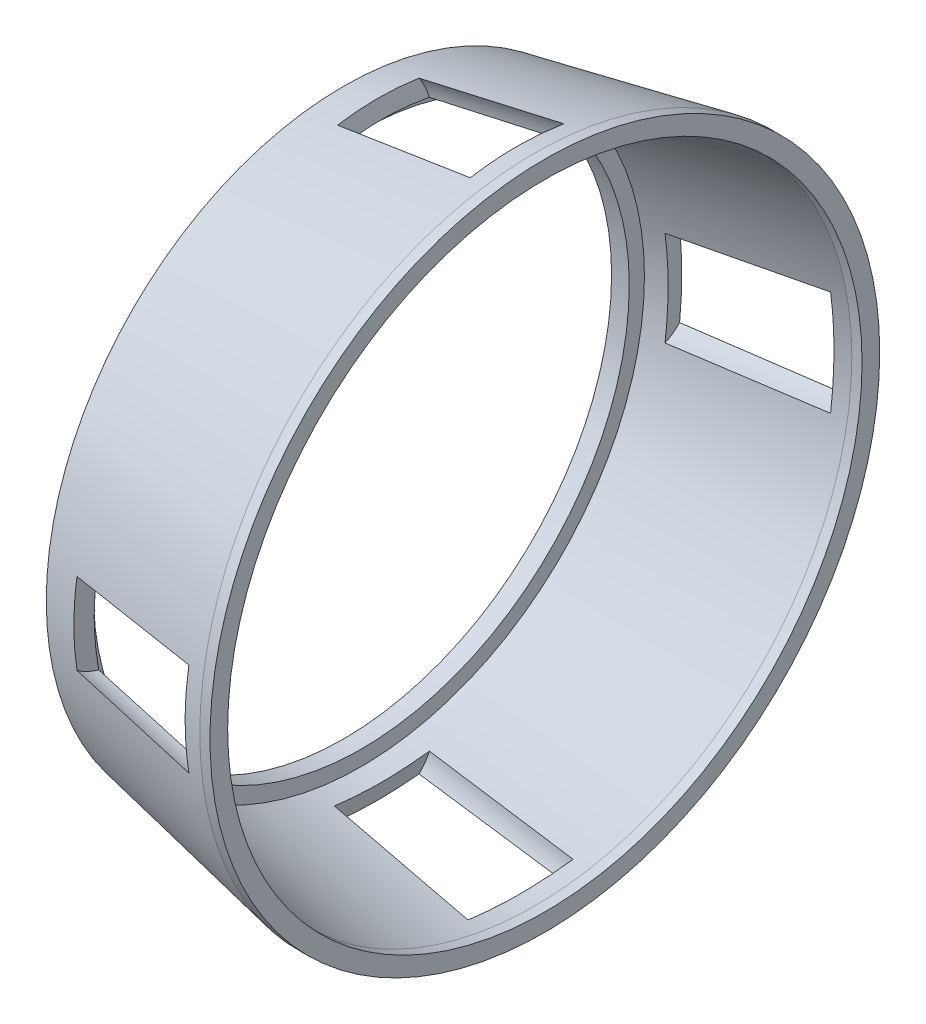
ISO-10303-21;
HEADER;
FILE_DESCRIPTION(('STEP AP214'),'2;1');
FILE_NAME('part.step','',(''),(''),'','','');
FILE_SCHEMA(('AUTOMOTIVE_DESIGN { 1 0 10303 214 1 1 1 1 }'));
ENDSEC;
DATA;
#1=APPLICATION_CONTEXT('core data for automotive mechanical design processes');
#2=APPLICATION_PROTOCOL_DEFINITION('international standard','automotive_design',2000,#1);
#3=PRODUCT_CONTEXT('',#1,'mechanical');
#4=PRODUCT('Part','Part','',(#3));
#5=PRODUCT_RELATED_PRODUCT_CATEGORY('part','',(#4));
#6=PRODUCT_DEFINITION_FORMATION('','',#4);
#7=PRODUCT_DEFINITION_CONTEXT('part definition',#1,'design');
#8=PRODUCT_DEFINITION('design','',#6,#7);
#9=PRODUCT_DEFINITION_SHAPE('','',#8);
#10=(LENGTH_UNIT() NAMED_UNIT(*) SI_UNIT(.MILLI.,.METRE.));
#11=(NAMED_UNIT(*) PLANE_ANGLE_UNIT() SI_UNIT($,.RADIAN.));
#12=(NAMED_UNIT(*) SI_UNIT($,.STERADIAN.) SOLID_ANGLE_UNIT());
#13=UNCERTAINTY_MEASURE_WITH_UNIT(LENGTH_MEASURE(1.E-05),#10,'distance_accuracy_value','');
#14=(GEOMETRIC_REPRESENTATION_CONTEXT(3) GLOBAL_UNCERTAINTY_ASSIGNED_CONTEXT((#13)) GLOBAL_UNIT_ASSIGNED_CONTEXT((#10,
#11,#12)) REPRESENTATION_CONTEXT('',''));
#15=CARTESIAN_POINT('',(0.,0.,0.));
#16=DIRECTION('',(0.,0.,1.));
#17=DIRECTION('',(1.,0.,0.));
#18=AXIS2_PLACEMENT_3D('',#15,#16,#17);
#19=CARTESIAN_POINT('',(15.1355647201062,0.,0.));
#20=DIRECTION('',(1.,0.,0.));
#21=DIRECTION('',(0.,0.,-1.));
#22=AXIS2_PLACEMENT_3D('',#19,#20,#21);
#23=CYLINDRICAL_SURFACE('',#22,25.1514621022042);
#24=CARTESIAN_POINT('',(15.9480647201062,0.,0.));
#25=DIRECTION('',(1.,0.,0.));
#26=DIRECTION('',(0.,0.,-1.));
#27=AXIS2_PLACEMENT_3D('',#24,#25,#26);
#28=CIRCLE('',#27,25.1514621022042);
#29=CARTESIAN_POINT('',(15.9480647201062,0.,-25.1514621022042));
#30=VERTEX_POINT('',#29);
#31=EDGE_CURVE('E367',#30,#30,#28,.F.);
#32=ORIENTED_EDGE('',*,*,#31,.F.);
#33=EDGE_LOOP('',(#32));
#34=FACE_BOUND('',#33,.T.);
#35=CARTESIAN_POINT('',(15.1355647201061,0.,0.));
#36=DIRECTION('',(1.,0.,0.));
#37=DIRECTION('',(0.,0.,1.));
#38=AXIS2_PLACEMENT_3D('',#35,#36,#37);
#39=CIRCLE('',#38,25.1514621022042);
#40=CARTESIAN_POINT('',(15.1355647201062,0.,25.1514621022042));
#41=VERTEX_POINT('',#40);
#42=EDGE_CURVE('E312',#41,#41,#39,.T.);
#43=ORIENTED_EDGE('',*,*,#42,.F.);
#44=EDGE_LOOP('',(#43));
#45=FACE_BOUND('',#44,.T.);
#46=ADVANCED_FACE('F16',(#34,#45),#23,.F.);
#47=CARTESIAN_POINT('',(1.4,0.,21.8409584046857));
#48=DIRECTION('',(1.,0.,0.));
#49=DIRECTION('',(0.,0.,-1.));
#50=AXIS2_PLACEMENT_3D('',#47,#48,#49);
#51=PLANE('',#50);
#52=CARTESIAN_POINT('',(1.4,0.,0.));
#53=DIRECTION('',(1.,0.,0.));
#54=DIRECTION('',(0.,0.,-1.));
#55=AXIS2_PLACEMENT_3D('',#52,#53,#54);
#56=CIRCLE('',#55,22.4432778729142);
#57=CARTESIAN_POINT('',(1.4,0.,-22.4432778729142));
#58=VERTEX_POINT('',#57);
#59=EDGE_CURVE('E394',#58,#58,#56,.F.);
#60=ORIENTED_EDGE('',*,*,#59,.F.);
#61=EDGE_LOOP('',(#60));
#62=FACE_BOUND('',#61,.T.);
#63=CARTESIAN_POINT('',(1.4,0.,0.));
#64=DIRECTION('',(1.,0.,0.));
#65=DIRECTION('',(0.,0.,-1.));
#66=AXIS2_PLACEMENT_3D('',#63,#64,#65);
#67=CIRCLE('',#66,21.2386389364571);
#68=CARTESIAN_POINT('',(1.4,0.,-21.2386389364571));
#69=VERTEX_POINT('',#68);
#70=EDGE_CURVE('E19',#69,#69,#67,.T.);
#71=ORIENTED_EDGE('',*,*,#70,.F.);
#72=EDGE_LOOP('',(#71));
#73=FACE_BOUND('',#72,.T.);
#74=ADVANCED_FACE('F464',(#62,#73),#51,.T.);
#75=CARTESIAN_POINT('',(0.,0.,0.));
#76=DIRECTION('',(1.,0.,0.));
#77=DIRECTION('',(0.,0.,-1.));
#78=AXIS2_PLACEMENT_3D('',#75,#76,#77);
#79=CYLINDRICAL_SURFACE('',#78,21.2386389364571);
#80=ORIENTED_EDGE('',*,*,#70,.T.);
#81=EDGE_LOOP('',(#80));
#82=FACE_BOUND('',#81,.T.);
#83=CARTESIAN_POINT('',(0.,0.,0.));
#84=DIRECTION('',(-1.,0.,0.));
#85=DIRECTION('',(0.,0.,1.));
#86=AXIS2_PLACEMENT_3D('',#83,#84,#85);
#87=CIRCLE('',#86,21.2386389364571);
#88=CARTESIAN_POINT('',(0.,0.,21.2386389364571));
#89=VERTEX_POINT('',#88);
#90=EDGE_CURVE('E390',#89,#89,#87,.F.);
#91=ORIENTED_EDGE('',*,*,#90,.F.);
#92=EDGE_LOOP('',(#91));
#93=FACE_BOUND('',#92,.T.);
#94=ADVANCED_FACE('F469',(#82,#93),#79,.F.);
#95=CARTESIAN_POINT('',(14.1192267530802,0.,24.0832738622719));
#96=DIRECTION('',(0.981111765721869,0.,0.193441730663568));
#97=DIRECTION('',(0.193441730663568,0.,-0.981111765721869));
#98=AXIS2_PLACEMENT_3D('',#95,#96,#97);
#99=CONICAL_SURFACE('',#98,4.19555633994165,0.0349065850396753);
#100=CARTESIAN_POINT('',(3.13077413196776,0.,21.9167263122294));
#101=DIRECTION('',(0.981111765721869,0.,0.193441730663568));
#102=DIRECTION('',(0.193441730663568,0.,-0.981111765721869));
#103=AXIS2_PLACEMENT_3D('',#100,#101,#102);
#104=CIRCLE('',#103,3.80444369155933);
#105=CARTESIAN_POINT('',(3.02558917990134,3.7653846271696,22.4502116177949));
#106=VERTEX_POINT('',#105);
#107=CARTESIAN_POINT('',(2.741598730072,3.22897177898043,23.8905742183531));
#108=VERTEX_POINT('',#107);
#109=EDGE_CURVE('E137',#106,#108,#104,.T.);
#110=ORIENTED_EDGE('',*,*,#109,.F.);
#111=CARTESIAN_POINT('',(14.0210123265384,4.16472181109687,24.5813999009074));
#112=CARTESIAN_POINT('',(11.3693615662704,4.06866518861723,24.0674102354313));
#113=CARTESIAN_POINT('',(8.71771260139438,3.97242972020751,23.5534448382961));
#114=CARTESIAN_POINT('',(5.05257320571358,3.83916466674904,22.8430690764369));
#115=CARTESIAN_POINT('',(4.03908124179892,3.80228780069724,22.6466379886429));
#116=CARTESIAN_POINT('',(3.02558954016635,3.76538480771235,22.4502104461202));
#117=B_SPLINE_CURVE_WITH_KNOTS('',3,(#111,#112,#113,#114,#115,#116),.UNSPECIFIED.,.F.,.F.,(4,2,
4),(0.,8.10814253388794,11.2071745323984),.UNSPECIFIED.);
#118=CARTESIAN_POINT('',(14.0210121664674,4.1647228152111,24.5814008476026));
#119=VERTEX_POINT('',#118);
#120=EDGE_CURVE('E140',#119,#106,#117,.T.);
#121=ORIENTED_EDGE('',*,*,#120,.F.);
#122=CARTESIAN_POINT('',(14.1192258880228,0.,24.0832736917121));
#123=DIRECTION('',(0.981111765721869,0.,0.193441730663568));
#124=DIRECTION('',(0.193441730663568,0.,-0.981111765721869));
#125=AXIS2_PLACEMENT_3D('',#122,#123,#124);
#126=CIRCLE('',#125,4.19555630915161);
#127=CARTESIAN_POINT('',(13.738666409527,3.70572632600995,26.0134186049544));
#128=VERTEX_POINT('',#127);
#129=EDGE_CURVE('E128',#128,#119,#126,.F.);
#130=ORIENTED_EDGE('',*,*,#129,.F.);
#131=CARTESIAN_POINT('',(2.74159871959979,3.22897177864657,23.8905742160836));
#132=CARTESIAN_POINT('',(3.9436445188656,3.28243660118682,24.1225048693107));
#133=CARTESIAN_POINT('',(5.14570458541623,3.33539738172634,24.354477316197));
#134=CARTESIAN_POINT('',(7.54984836969822,3.4404319561745,24.8184983559459));
#135=CARTESIAN_POINT('',(8.75193208742152,3.49250575038029,25.0505469487831));
#136=CARTESIAN_POINT('',(10.5847937875688,3.57132009450157,25.4044096743726));
#137=CARTESIAN_POINT('',(11.215564677987,3.59833813766485,25.5261988569271));
#138=CARTESIAN_POINT('',(12.477111503899,3.6521768623121,25.7697953134106));
#139=CARTESIAN_POINT('',(13.1078874393937,3.67899754376145,25.8916025873427));
#140=CARTESIAN_POINT('',(13.7386656147459,3.70572629233139,26.013418451467));
#141=B_SPLINE_CURVE_WITH_KNOTS('',3,(#131,#132,#133,#134,#135,#136,#137,#138,#139,#140),
.UNSPECIFIED.,.F.,.F.,(4,2,2,2,4),(0.,3.67614990717601,7.35229858275312,9.28126472329107,
11.2102312020895),.UNSPECIFIED.);
#142=EDGE_CURVE('E297',#108,#128,#141,.T.);
#143=ORIENTED_EDGE('',*,*,#142,.F.);
#144=EDGE_LOOP('',(#110,#121,#130,#143));
#145=FACE_BOUND('',#144,.T.);
#146=ADVANCED_FACE('F141',(#145),#99,.F.);
#147=CARTESIAN_POINT('',(14.1192267530802,0.,-24.0832738622719));
#148=DIRECTION('',(0.981111765721869,0.,-0.193441730663568));
#149=DIRECTION('',(-0.193441730663568,0.,-0.981111765721869));
#150=AXIS2_PLACEMENT_3D('',#147,#148,#149);
#151=CONICAL_SURFACE('',#150,4.19555633994165,0.0349065850390787);
#152=CARTESIAN_POINT('',(14.1192258984662,0.,-24.0832736937712));
#153=DIRECTION('',(0.981111765721869,0.,-0.193441730663568));
#154=DIRECTION('',(-0.193441730663568,0.,-0.981111765721869));
#155=AXIS2_PLACEMENT_3D('',#152,#153,#154);
#156=CIRCLE('',#155,4.19555630952333);
#157=CARTESIAN_POINT('',(14.0210119303832,4.16472272586724,-24.5814015180556));
#158=VERTEX_POINT('',#157);
#159=CARTESIAN_POINT('',(13.7386664153131,3.70572632619874,-26.0134186061817));
#160=VERTEX_POINT('',#159);
#161=EDGE_CURVE('E383',#158,#160,#156,.F.);
#162=ORIENTED_EDGE('',*,*,#161,.F.);
#163=CARTESIAN_POINT('',(3.02558961379372,3.7653832528626,-22.4502089165986));
#164=CARTESIAN_POINT('',(5.43004712645405,3.85292583876789,-22.9162251074709));
#165=CARTESIAN_POINT('',(7.83450607404846,3.94032691043491,-23.382260401431));
#166=CARTESIAN_POINT('',(11.4996478760073,4.07333748273483,-24.0926715460766));
#167=CARTESIAN_POINT('',(12.7603296899017,4.11904959527805,-24.3370335451218));
#168=CARTESIAN_POINT('',(14.0210118982602,4.16472280549332,-24.5814007956144));
#169=B_SPLINE_CURVE_WITH_KNOTS('',3,(#163,#164,#165,#166,#167,#168),.UNSPECIFIED.,.F.,.F.,(4,2,
4),(0.,7.35229597193329,11.207174592234),.UNSPECIFIED.);
#170=CARTESIAN_POINT('',(3.02558927122087,3.76538479792567,-22.4502103939954));
#171=VERTEX_POINT('',#170);
#172=EDGE_CURVE('E145',#171,#158,#169,.T.);
#173=ORIENTED_EDGE('',*,*,#172,.F.);
#174=CARTESIAN_POINT('',(3.13077411198325,0.,-21.9167263082891));
#175=DIRECTION('',(0.981111765721869,0.,-0.193441730663568));
#176=DIRECTION('',(-0.193441730663568,0.,-0.981111765721869));
#177=AXIS2_PLACEMENT_3D('',#174,#175,#176);
#178=CIRCLE('',#177,3.80444369085471);
#179=CARTESIAN_POINT('',(2.74159871899224,3.22897177863572,-23.8905742159828));
#180=VERTEX_POINT('',#179);
#181=EDGE_CURVE('E385',#180,#171,#178,.T.);
#182=ORIENTED_EDGE('',*,*,#181,.F.);
#183=CARTESIAN_POINT('',(13.7386656159059,3.7057262923749,-26.0134184516829));
#184=CARTESIAN_POINT('',(12.4129710419235,3.64954550863344,-25.757400541735));
#185=CARTESIAN_POINT('',(11.0872858615223,3.59296853197617,-25.5014201357073));
#186=CARTESIAN_POINT('',(8.43594039996302,3.47887025863389,-24.9895438767847));
#187=CARTESIAN_POINT('',(7.110280118795,3.42134896233769,-24.7336480238549));
#188=CARTESIAN_POINT('',(5.27745749793218,3.34106278529178,-24.3799141399587));
#189=CARTESIAN_POINT('',(4.77028238815305,3.31876581955304,-24.2820360365662));
#190=CARTESIAN_POINT('',(3.75593688817647,3.2740002839316,-24.0862941919418));
#191=CARTESIAN_POINT('',(3.24876649797978,3.25153171402193,-23.9884304507123));
#192=CARTESIAN_POINT('',(2.74159871734958,3.22897177856447,-23.8905742156629));
#193=B_SPLINE_CURVE_WITH_KNOTS('',3,(#183,#184,#185,#186,#187,#188,#189,#190,#191,#192),
.UNSPECIFIED.,.F.,.F.,(4,2,2,2,4),(0.,4.0540731976591,8.1081447260993,9.65918784201369,
11.2102312017207),.UNSPECIFIED.);
#194=EDGE_CURVE('E303',#160,#180,#193,.T.);
#195=ORIENTED_EDGE('',*,*,#194,.F.);
#196=EDGE_LOOP('',(#162,#173,#182,#195));
#197=FACE_BOUND('',#196,.T.);
#198=ADVANCED_FACE('F480',(#197),#151,.F.);
#199=CARTESIAN_POINT('',(3.49874319784223,20.0504340747262,0.));
#200=DIRECTION('',(-0.981111765721869,-0.19344173066357,0.));
#201=DIRECTION('',(0.19344173066357,-0.981111765721869,0.));
#202=AXIS2_PLACEMENT_3D('',#199,#200,#201);
#203=PLANE('',#202);
#204=CARTESIAN_POINT('',(3.13077411198323,21.9167263082891,0.));
#205=DIRECTION('',(0.981111765721869,0.193441730663568,0.));
#206=DIRECTION('',(-0.193441730663568,0.981111765721869,0.));
#207=AXIS2_PLACEMENT_3D('',#204,#205,#206);
#208=CIRCLE('',#207,3.80444369085471);
#209=CARTESIAN_POINT('',(2.7415982734716,23.8905741300212,3.22897175881799));
#210=VERTEX_POINT('',#209);
#211=CARTESIAN_POINT('',(3.02558923305832,22.4502103865977,3.76538479653621));
#212=VERTEX_POINT('',#211);
#213=EDGE_CURVE('E372',#210,#212,#208,.T.);
#214=ORIENTED_EDGE('',*,*,#213,.T.);
#215=CARTESIAN_POINT('',(7.63344501785614,-0.920245775230442,0.));
#216=DIRECTION('',(-0.981111765721869,-0.19344173066357,0.));
#217=DIRECTION('',(0.19344173066357,-0.981111765721869,0.));
#218=AXIS2_PLACEMENT_3D('',#215,#216,#217);
#219=ELLIPSE('',#218,24.1280363321662,23.6544065787227);
#220=CARTESIAN_POINT('',(3.02558898479655,22.4502118994247,-3.76538271545805));
#221=VERTEX_POINT('',#220);
#222=EDGE_CURVE('E144',#221,#212,#219,.F.);
#223=ORIENTED_EDGE('',*,*,#222,.F.);
#224=CARTESIAN_POINT('',(3.13077413196776,21.9167263122294,0.));
#225=DIRECTION('',(0.981111765721869,0.193441730663568,0.));
#226=DIRECTION('',(-0.193441730663568,0.981111765721869,0.));
#227=AXIS2_PLACEMENT_3D('',#224,#225,#226);
#228=CIRCLE('',#227,3.80444369155933);
#229=CARTESIAN_POINT('',(2.74159871959979,23.8905742160836,-3.22897177864656));
#230=VERTEX_POINT('',#229);
#231=EDGE_CURVE('E379',#221,#230,#228,.T.);
#232=ORIENTED_EDGE('',*,*,#231,.T.);
#233=CARTESIAN_POINT('',(7.64419183601672,-0.974752265144777,0.));
#234=DIRECTION('',(-0.981111765721869,-0.19344173066357,0.));
#235=DIRECTION('',(0.19344173066357,-0.981111765721869,0.));
#236=AXIS2_PLACEMENT_3D('',#233,#234,#235);
#237=ELLIPSE('',#236,25.557148645844,25.055465630898);
#238=EDGE_CURVE('E392',#210,#230,#237,.T.);
#239=ORIENTED_EDGE('',*,*,#238,.F.);
#240=EDGE_LOOP('',(#214,#223,#232,#239));
#241=FACE_BOUND('',#240,.T.);
#242=ADVANCED_FACE('F444',(#241),#203,.F.);
#243=CARTESIAN_POINT('',(14.1192267530802,24.0832738622719,0.));
#244=DIRECTION('',(0.981111765721869,0.193441730663568,0.));
#245=DIRECTION('',(-0.193441730663568,0.981111765721869,0.));
#246=AXIS2_PLACEMENT_3D('',#243,#244,#245);
#247=CONICAL_SURFACE('',#246,4.19555633994165,0.0349065850396753);
#248=ORIENTED_EDGE('',*,*,#231,.F.);
#249=CARTESIAN_POINT('',(14.0210123609872,24.5814000013766,-4.1647219092248));
#250=CARTESIAN_POINT('',(11.3693616115401,24.0674102841149,-4.06866523148316));
#251=CARTESIAN_POINT('',(8.7177126524488,23.5534448568369,-3.97242973099196));
#252=CARTESIAN_POINT('',(5.05257314406587,22.843069061184,-3.83916466109494));
#253=CARTESIAN_POINT('',(4.039081065965,22.6466379512592,-3.80228779088608));
#254=CARTESIAN_POINT('',(3.02558924941056,22.4502103897682,-3.76538479712461));
#255=B_SPLINE_CURVE_WITH_KNOTS('',3,(#249,#250,#251,#252,#253,#254),.UNSPECIFIED.,.F.,.F.,(4,2,
4),(0.,8.10814253748534,11.2071748851518),.UNSPECIFIED.);
#256=CARTESIAN_POINT('',(14.0210121941312,24.5814008529649,-4.1647228162134));
#257=VERTEX_POINT('',#256);
#258=EDGE_CURVE('E196',#257,#221,#255,.T.);
#259=ORIENTED_EDGE('',*,*,#258,.F.);
#260=CARTESIAN_POINT('',(14.1192258880228,24.0832736917121,0.));
#261=DIRECTION('',(0.981111765721869,0.193441730663568,0.));
#262=DIRECTION('',(-0.193441730663568,0.981111765721869,0.));
#263=AXIS2_PLACEMENT_3D('',#260,#261,#262);
#264=CIRCLE('',#263,4.19555630915161);
#265=CARTESIAN_POINT('',(13.7386651314317,26.0134278327535,-3.70569356500784));
#266=VERTEX_POINT('',#265);
#267=EDGE_CURVE('E376',#257,#266,#264,.T.);
#268=ORIENTED_EDGE('',*,*,#267,.T.);
#269=CARTESIAN_POINT('',(2.74159871959979,23.8905742160836,-3.22897177864656));
#270=CARTESIAN_POINT('',(3.9436445188656,24.1225048693107,-3.28243660118682));
#271=CARTESIAN_POINT('',(5.14570458541622,24.354477316197,-3.33539738172634));
#272=CARTESIAN_POINT('',(7.54984836969821,24.8184983559459,-3.44043195617449));
#273=CARTESIAN_POINT('',(8.75193208742152,25.0505469487831,-3.49250575038028));
#274=CARTESIAN_POINT('',(10.584793778202,25.4044096725642,-3.57132009409878));
#275=CARTESIAN_POINT('',(11.2155646592532,25.52619885331,-3.59833813686242));
#276=CARTESIAN_POINT('',(12.4771114664312,25.7697953061756,-3.65217686071603));
#277=CARTESIAN_POINT('',(13.1078873925588,25.8916025782985,-3.6789975417714));
#278=CARTESIAN_POINT('',(13.7386655585439,26.0134184406132,-3.70572628994988));
#279=B_SPLINE_CURVE_WITH_KNOTS('',3,(#269,#270,#271,#272,#273,#274,#275,#276,#277,#278),
.UNSPECIFIED.,.F.,.F.,(4,2,2,2,4),(0.,3.676149907176,7.35229858275312,9.28126469464611,
11.2102311447996),.UNSPECIFIED.);
#280=EDGE_CURVE('E438',#230,#266,#279,.T.);
#281=ORIENTED_EDGE('',*,*,#280,.F.);
#282=EDGE_LOOP('',(#248,#259,#268,#281));
#283=FACE_BOUND('',#282,.T.);
#284=ADVANCED_FACE('F458',(#283),#247,.F.);
#285=CARTESIAN_POINT('',(14.525023724812,22.0251188623863,0.));
#286=DIRECTION('',(0.981111765721869,0.19344173066357,0.));
#287=DIRECTION('',(-0.19344173066357,0.981111765721869,0.));
#288=AXIS2_PLACEMENT_3D('',#285,#286,#287);
#289=PLANE('',#288);
#290=ORIENTED_EDGE('',*,*,#267,.F.);
#291=CARTESIAN_POINT('',(19.0663435272792,-1.00787549111855,0.));
#292=DIRECTION('',(0.981111765721869,0.19344173066357,0.));
#293=DIRECTION('',(0.19344173066357,-0.981111765721869,0.));
#294=AXIS2_PLACEMENT_3D('',#291,#292,#293);
#295=ELLIPSE('',#294,26.4256105516146,25.9068797590275);
#296=CARTESIAN_POINT('',(14.0210121850443,24.5814010841266,4.16472144101919));
#297=VERTEX_POINT('',#296);
#298=EDGE_CURVE('E454',#297,#257,#295,.F.);
#299=ORIENTED_EDGE('',*,*,#298,.F.);
#300=CARTESIAN_POINT('',(14.1192258984662,24.0832736937712,0.));
#301=DIRECTION('',(0.981111765721869,0.193441730663568,0.));
#302=DIRECTION('',(-0.193441730663568,0.981111765721869,0.));
#303=AXIS2_PLACEMENT_3D('',#300,#301,#302);
#304=CIRCLE('',#303,4.19555630952333);
#305=CARTESIAN_POINT('',(13.7386663873709,26.0134186007855,3.70572632501472));
#306=VERTEX_POINT('',#305);
#307=EDGE_CURVE('E369',#297,#306,#304,.F.);
#308=ORIENTED_EDGE('',*,*,#307,.T.);
#309=CARTESIAN_POINT('',(19.0770903454397,-1.06238198103289,0.));
#310=DIRECTION('',(0.981111765721869,0.19344173066357,0.));
#311=DIRECTION('',(0.19344173066357,-0.981111765721869,0.));
#312=AXIS2_PLACEMENT_3D('',#309,#310,#311);
#313=ELLIPSE('',#312,27.8547228652925,27.3079388112028);
#314=EDGE_CURVE('E434',#266,#306,#313,.T.);
#315=ORIENTED_EDGE('',*,*,#314,.F.);
#316=EDGE_LOOP('',(#290,#299,#308,#315));
#317=FACE_BOUND('',#316,.T.);
#318=ADVANCED_FACE('F459',(#317),#289,.F.);
#319=CARTESIAN_POINT('',(14.1192267530802,24.0832738622719,0.));
#320=DIRECTION('',(0.981111765721869,0.193441730663568,0.));
#321=DIRECTION('',(-0.193441730663568,0.981111765721869,0.));
#322=AXIS2_PLACEMENT_3D('',#319,#320,#321);
#323=CONICAL_SURFACE('',#322,4.19555633994165,0.0349065850390787);
#324=ORIENTED_EDGE('',*,*,#307,.F.);
#325=CARTESIAN_POINT('',(3.02558956818623,22.4502087693398,3.76538311154964));
#326=CARTESIAN_POINT('',(5.43004706227509,22.9162250330214,3.85292577387163));
#327=CARTESIAN_POINT('',(7.83450599801377,23.3822603708231,3.94032689166107));
#328=CARTESIAN_POINT('',(11.4996478413929,24.0926715476882,4.07333748987546));
#329=CARTESIAN_POINT('',(12.7603297036937,24.3370335561161,4.11904960417407));
#330=CARTESIAN_POINT('',(14.0210119623048,24.5814008080286,4.16472280781378));
#331=B_SPLINE_CURVE_WITH_KNOTS('',3,(#325,#326,#327,#328,#329,#330),.UNSPECIFIED.,.F.,.F.,(4,2,
4),(0.,7.35229596698335,11.2071747352999),.UNSPECIFIED.);
#332=EDGE_CURVE('E205',#212,#297,#331,.T.);
#333=ORIENTED_EDGE('',*,*,#332,.F.);
#334=ORIENTED_EDGE('',*,*,#213,.F.);
#335=CARTESIAN_POINT('',(13.7386655600216,26.0134184408866,3.70572629000412));
#336=CARTESIAN_POINT('',(12.4129709866669,25.7574005310635,3.64954550627956));
#337=CARTESIAN_POINT('',(11.0872858068938,25.5014201251592,3.59296852963777));
#338=CARTESIAN_POINT('',(8.43594034659109,24.989543866482,3.47887025632448));
#339=CARTESIAN_POINT('',(7.11028006605153,24.7336480136744,3.42134896004182));
#340=CARTESIAN_POINT('',(5.27745730599318,24.379914102915,3.34106277687843));
#341=CARTESIAN_POINT('',(4.77028205639128,24.2820359725408,3.3187658049648));
#342=CARTESIAN_POINT('',(3.7559362767719,24.0862940739611,3.27400025689555));
#343=CARTESIAN_POINT('',(3.24876574675516,23.9884303057579,3.25153168071295));
#344=CARTESIAN_POINT('',(2.74159782630649,23.8905740437393,3.22897173892891));
#345=B_SPLINE_CURVE_WITH_KNOTS('',3,(#335,#336,#337,#338,#339,#340,#341,#342,#343,#344),
.UNSPECIFIED.,.F.,.F.,(4,2,2,2,4),(0.,4.05407319573863,8.10814472225817,9.65918826578092,
11.2102320530964),.UNSPECIFIED.);
#346=EDGE_CURVE('E282',#306,#210,#345,.T.);
#347=ORIENTED_EDGE('',*,*,#346,.F.);
#348=EDGE_LOOP('',(#324,#333,#334,#347));
#349=FACE_BOUND('',#348,.T.);
#350=ADVANCED_FACE('F448',(#349),#323,.F.);
#351=CARTESIAN_POINT('',(15.9480647201062,0.,25.8514621022042));
#352=DIRECTION('',(1.,0.,0.));
#353=DIRECTION('',(0.,0.,-1.));
#354=AXIS2_PLACEMENT_3D('',#351,#352,#353);
#355=PLANE('',#354);
#356=CARTESIAN_POINT('',(15.9480647201062,0.,0.));
#357=DIRECTION('',(1.,0.,0.));
#358=DIRECTION('',(0.,0.,-1.));
#359=AXIS2_PLACEMENT_3D('',#356,#357,#358);
#360=CIRCLE('',#359,26.5514621022042);
#361=CARTESIAN_POINT('',(15.9480647201062,0.,-26.5514621022042));
#362=VERTEX_POINT('',#361);
#363=EDGE_CURVE('E152',#362,#362,#360,.F.);
#364=ORIENTED_EDGE('',*,*,#363,.F.);
#365=EDGE_LOOP('',(#364));
#366=FACE_BOUND('',#365,.T.);
#367=ORIENTED_EDGE('',*,*,#31,.T.);
#368=EDGE_LOOP('',(#367));
#369=FACE_BOUND('',#368,.T.);
#370=ADVANCED_FACE('F189',(#366,#369),#355,.T.);
#371=CARTESIAN_POINT('',(1.4,0.,0.));
#372=DIRECTION('',(1.,0.,0.));
#373=DIRECTION('',(0.,0.,-1.));
#374=AXIS2_PLACEMENT_3D('',#371,#372,#373);
#375=CONICAL_SURFACE('',#374,22.4432778729142,0.194668931800294);
#376=ORIENTED_EDGE('',*,*,#120,.T.);
#377=CARTESIAN_POINT('',(7.63344501785614,0.,-0.920245775230449));
#378=DIRECTION('',(-0.981111765721869,0.,-0.19344173066357));
#379=DIRECTION('',(0.19344173066357,0.,-0.981111765721869));
#380=AXIS2_PLACEMENT_3D('',#377,#378,#379);
#381=ELLIPSE('',#380,24.1280363321662,23.6544065787227);
#382=CARTESIAN_POINT('',(3.02558926735128,-3.76538467585985,22.4502104136936));
#383=VERTEX_POINT('',#382);
#384=EDGE_CURVE('E389',#106,#383,#381,.F.);
#385=ORIENTED_EDGE('',*,*,#384,.T.);
#386=CARTESIAN_POINT('',(3.02558924440476,-3.76538491883063,22.4502105096024));
#387=CARTESIAN_POINT('',(5.43004695976595,-3.85292658505796,22.9162258208844));
#388=CARTESIAN_POINT('',(7.83450602929949,-3.94032710135911,23.3822605836125));
#389=CARTESIAN_POINT('',(11.4996480044365,-4.07333738644079,24.0926714709027));
#390=CARTESIAN_POINT('',(12.7603299281303,-4.11904950296233,24.3370334912311));
#391=CARTESIAN_POINT('',(14.0210122240867,-4.16472281729869,24.5814008587717));
#392=B_SPLINE_CURVE_WITH_KNOTS('',3,(#386,#387,#388,#389,#390,#391),.UNSPECIFIED.,.F.,.F.,(4,2,
4),(0.,7.35229596836559,11.2071749244078),.UNSPECIFIED.);
#393=CARTESIAN_POINT('',(14.0210122292887,-4.16472281748885,24.5814008597651));
#394=VERTEX_POINT('',#393);
#395=EDGE_CURVE('E150',#383,#394,#392,.T.);
#396=ORIENTED_EDGE('',*,*,#395,.T.);
#397=CARTESIAN_POINT('',(19.0663435272792,0.,-1.00787549111855));
#398=DIRECTION('',(0.981111765721869,0.,0.19344173066357));
#399=DIRECTION('',(0.19344173066357,0.,-0.981111765721869));
#400=AXIS2_PLACEMENT_3D('',#397,#398,#399);
#401=ELLIPSE('',#400,26.4256105516146,25.9068797590275);
#402=EDGE_CURVE('E132',#394,#119,#401,.F.);
#403=ORIENTED_EDGE('',*,*,#402,.T.);
#404=EDGE_LOOP('',(#376,#385,#396,#403));
#405=FACE_BOUND('',#404,.T.);
#406=ORIENTED_EDGE('',*,*,#42,.T.);
#407=EDGE_LOOP('',(#406));
#408=FACE_BOUND('',#407,.T.);
#409=ORIENTED_EDGE('',*,*,#172,.T.);
#410=CARTESIAN_POINT('',(19.0663435272792,0.,1.00787549111855));
#411=DIRECTION('',(0.981111765721869,0.,-0.19344173066357));
#412=DIRECTION('',(0.19344173066357,0.,0.981111765721869));
#413=AXIS2_PLACEMENT_3D('',#410,#411,#412);
#414=ELLIPSE('',#413,26.4256105516146,25.9068797590275);
#415=CARTESIAN_POINT('',(14.0210122219572,-4.16472275166352,-24.5814008694661));
#416=VERTEX_POINT('',#415);
#417=EDGE_CURVE('E167',#158,#416,#414,.F.);
#418=ORIENTED_EDGE('',*,*,#417,.T.);
#419=CARTESIAN_POINT('',(14.0210122081425,-4.16472289062739,-24.5814009272317));
#420=CARTESIAN_POINT('',(11.3693615802567,-4.06866565030246,-24.0674106846154));
#421=CARTESIAN_POINT('',(8.71771269142105,-3.97242982337904,-23.5534449524611));
#422=CARTESIAN_POINT('',(5.05257319743556,-3.83916462826544,-22.8430690378664));
#423=CARTESIAN_POINT('',(4.03908110728701,-3.80228775761896,-22.6466379256065));
#424=CARTESIAN_POINT('',(3.02558927118986,-3.76538479791769,-22.4502103939893));
#425=B_SPLINE_CURVE_WITH_KNOTS('',3,(#419,#420,#421,#422,#423,#424),.UNSPECIFIED.,.F.,.F.,(4,2,
4),(0.,8.10814253950207,11.2071749240076),.UNSPECIFIED.);
#426=CARTESIAN_POINT('',(3.02558928122958,-3.76538479828709,-22.4502103959069));
#427=VERTEX_POINT('',#426);
#428=EDGE_CURVE('E171',#416,#427,#425,.T.);
#429=ORIENTED_EDGE('',*,*,#428,.T.);
#430=CARTESIAN_POINT('',(7.63344501785614,0.,0.920245775230449));
#431=DIRECTION('',(-0.981111765721869,0.,0.19344173066357));
#432=DIRECTION('',(0.19344173066357,0.,0.981111765721869));
#433=AXIS2_PLACEMENT_3D('',#430,#431,#432);
#434=ELLIPSE('',#433,24.1280363321662,23.6544065787227);
#435=EDGE_CURVE('E178',#427,#171,#434,.F.);
#436=ORIENTED_EDGE('',*,*,#435,.T.);
#437=EDGE_LOOP('',(#409,#418,#429,#436));
#438=FACE_BOUND('',#437,.T.);
#439=CARTESIAN_POINT('',(19.0663435272792,1.00787549111855,0.));
#440=DIRECTION('',(0.981111765721869,-0.19344173066357,0.));
#441=DIRECTION('',(0.19344173066357,0.981111765721869,0.));
#442=AXIS2_PLACEMENT_3D('',#439,#440,#441);
#443=ELLIPSE('',#442,26.4256105516146,25.9068797590275);
#444=CARTESIAN_POINT('',(14.0210122292887,-24.5814008597651,-4.16472281748885));
#445=VERTEX_POINT('',#444);
#446=CARTESIAN_POINT('',(14.0210122219572,-24.5814008694661,4.16472275166352));
#447=VERTEX_POINT('',#446);
#448=EDGE_CURVE('E414',#445,#447,#443,.F.);
#449=ORIENTED_EDGE('',*,*,#448,.T.);
#450=CARTESIAN_POINT('',(14.0210122081425,-24.5814009272317,4.16472289062739));
#451=CARTESIAN_POINT('',(11.3693615802567,-24.0674106846154,4.06866565030246));
#452=CARTESIAN_POINT('',(8.71771269142104,-23.5534449524611,3.97242982337904));
#453=CARTESIAN_POINT('',(5.05257319743556,-22.8430690378664,3.83916462826544));
#454=CARTESIAN_POINT('',(4.03908110728701,-22.6466379256065,3.80228775761896));
#455=CARTESIAN_POINT('',(3.02558927118986,-22.4502103939892,3.76538479791769));
#456=B_SPLINE_CURVE_WITH_KNOTS('',3,(#450,#451,#452,#453,#454,#455),.UNSPECIFIED.,.F.,.F.,(4,2,
4),(0.,8.10814253950207,11.2071749240076),.UNSPECIFIED.);
#457=CARTESIAN_POINT('',(3.02558928122958,-22.4502103959069,3.76538479828709));
#458=VERTEX_POINT('',#457);
#459=EDGE_CURVE('E231',#447,#458,#456,.T.);
#460=ORIENTED_EDGE('',*,*,#459,.T.);
#461=CARTESIAN_POINT('',(7.63344501785614,0.920245775230442,0.));
#462=DIRECTION('',(-0.981111765721869,0.19344173066357,0.));
#463=DIRECTION('',(0.19344173066357,0.981111765721869,0.));
#464=AXIS2_PLACEMENT_3D('',#461,#462,#463);
#465=ELLIPSE('',#464,24.1280363321662,23.6544065787227);
#466=CARTESIAN_POINT('',(3.02558926735128,-22.4502104136936,-3.76538467585985));
#467=VERTEX_POINT('',#466);
#468=EDGE_CURVE('E239',#458,#467,#465,.F.);
#469=ORIENTED_EDGE('',*,*,#468,.T.);
#470=CARTESIAN_POINT('',(3.02558924440476,-22.4502105096024,-3.76538491883063));
#471=CARTESIAN_POINT('',(5.43004695976595,-22.9162258208844,-3.85292658505796));
#472=CARTESIAN_POINT('',(7.83450602929949,-23.3822605836125,-3.94032710135911));
#473=CARTESIAN_POINT('',(11.4996480044365,-24.0926714709027,-4.07333738644079));
#474=CARTESIAN_POINT('',(12.7603299281303,-24.3370334912311,-4.11904950296233));
#475=CARTESIAN_POINT('',(14.0210122240867,-24.5814008587717,-4.16472281729868));
#476=B_SPLINE_CURVE_WITH_KNOTS('',3,(#470,#471,#472,#473,#474,#475),.UNSPECIFIED.,.F.,.F.,(4,2,
4),(0.,7.3522959683656,11.2071749244078),.UNSPECIFIED.);
#477=EDGE_CURVE('E223',#467,#445,#476,.T.);
#478=ORIENTED_EDGE('',*,*,#477,.T.);
#479=EDGE_LOOP('',(#449,#460,#469,#478));
#480=FACE_BOUND('',#479,.T.);
#481=ORIENTED_EDGE('',*,*,#59,.T.);
#482=EDGE_LOOP('',(#481));
#483=FACE_BOUND('',#482,.T.);
#484=ORIENTED_EDGE('',*,*,#298,.T.);
#485=ORIENTED_EDGE('',*,*,#258,.T.);
#486=ORIENTED_EDGE('',*,*,#222,.T.);
#487=ORIENTED_EDGE('',*,*,#332,.T.);
#488=EDGE_LOOP('',(#484,#485,#486,#487));
#489=FACE_BOUND('',#488,.T.);
#490=ADVANCED_FACE('F147',(#405,#408,#438,#480,#483,#489),#375,.F.);
#491=CARTESIAN_POINT('',(0.,0.,0.));
#492=DIRECTION('',(-1.,0.,0.));
#493=DIRECTION('',(0.,0.,1.));
#494=AXIS2_PLACEMENT_3D('',#491,#492,#493);
#495=CONICAL_SURFACE('',#494,21.2386389364571,1.56088369818689);
#496=ORIENTED_EDGE('',*,*,#90,.T.);
#497=EDGE_LOOP('',(#496));
#498=FACE_BOUND('',#497,.T.);
#499=CARTESIAN_POINT('',(-0.0230383416378876,0.,0.));
#500=DIRECTION('',(1.,0.,0.));
#501=DIRECTION('',(0.,0.,1.));
#502=AXIS2_PLACEMENT_3D('',#499,#500,#501);
#503=CIRCLE('',#502,23.5627033153311);
#504=CARTESIAN_POINT('',(-0.0230383416378859,0.,23.5627033153311));
#505=VERTEX_POINT('',#504);
#506=EDGE_CURVE('E402',#505,#505,#503,.T.);
#507=ORIENTED_EDGE('',*,*,#506,.F.);
#508=EDGE_LOOP('',(#507));
#509=FACE_BOUND('',#508,.T.);
#510=ADVANCED_FACE('F188',(#498,#509),#495,.F.);
#511=CARTESIAN_POINT('',(3.49874319784223,0.,-20.0504340747262));
#512=DIRECTION('',(-0.981111765721869,0.,0.19344173066357));
#513=DIRECTION('',(0.19344173066357,0.,0.981111765721869));
#514=AXIS2_PLACEMENT_3D('',#511,#512,#513);
#515=PLANE('',#514);
#516=ORIENTED_EDGE('',*,*,#181,.T.);
#517=ORIENTED_EDGE('',*,*,#435,.F.);
#518=CARTESIAN_POINT('',(3.13077413196776,0.,-21.9167263122294));
#519=DIRECTION('',(0.981111765721869,0.,-0.193441730663568));
#520=DIRECTION('',(-0.193441730663568,0.,-0.981111765721869));
#521=AXIS2_PLACEMENT_3D('',#518,#519,#520);
#522=CIRCLE('',#521,3.80444369155933);
#523=CARTESIAN_POINT('',(2.741598730072,-3.22897177898043,-23.8905742183531));
#524=VERTEX_POINT('',#523);
#525=EDGE_CURVE('E169',#427,#524,#522,.T.);
#526=ORIENTED_EDGE('',*,*,#525,.T.);
#527=CARTESIAN_POINT('',(7.64419183601672,0.,0.974752265144777));
#528=DIRECTION('',(-0.981111765721869,0.,0.19344173066357));
#529=DIRECTION('',(0.19344173066357,0.,0.981111765721869));
#530=AXIS2_PLACEMENT_3D('',#527,#528,#529);
#531=ELLIPSE('',#530,25.557148645844,25.055465630898);
#532=EDGE_CURVE('E404',#180,#524,#531,.T.);
#533=ORIENTED_EDGE('',*,*,#532,.F.);
#534=EDGE_LOOP('',(#516,#517,#526,#533));
#535=FACE_BOUND('',#534,.T.);
#536=ADVANCED_FACE('F348',(#535),#515,.F.);
#537=CARTESIAN_POINT('',(14.1192267530802,0.,-24.0832738622719));
#538=DIRECTION('',(0.981111765721869,0.,-0.193441730663568));
#539=DIRECTION('',(-0.193441730663568,0.,-0.981111765721869));
#540=AXIS2_PLACEMENT_3D('',#537,#538,#539);
#541=CONICAL_SURFACE('',#540,4.19555633994165,0.0349065850396753);
#542=ORIENTED_EDGE('',*,*,#525,.F.);
#543=ORIENTED_EDGE('',*,*,#428,.F.);
#544=CARTESIAN_POINT('',(14.1192258880228,0.,-24.0832736917121));
#545=DIRECTION('',(0.981111765721869,0.,-0.193441730663568));
#546=DIRECTION('',(-0.193441730663568,0.,-0.981111765721869));
#547=AXIS2_PLACEMENT_3D('',#544,#545,#546);
#548=CIRCLE('',#547,4.19555630915161);
#549=CARTESIAN_POINT('',(13.7386663813674,-3.70572632481671,-26.0134185995162));
#550=VERTEX_POINT('',#549);
#551=EDGE_CURVE('E157',#416,#550,#548,.T.);
#552=ORIENTED_EDGE('',*,*,#551,.T.);
#553=CARTESIAN_POINT('',(2.74159871959979,-3.22897177864657,-23.8905742160836));
#554=CARTESIAN_POINT('',(3.9436445188656,-3.2824366011868,-24.1225048693107));
#555=CARTESIAN_POINT('',(5.14570458541623,-3.33539738172632,-24.354477316197));
#556=CARTESIAN_POINT('',(7.54984836969822,-3.44043195617449,-24.8184983559459));
#557=CARTESIAN_POINT('',(8.75193208742153,-3.49250575038029,-25.0505469487831));
#558=CARTESIAN_POINT('',(10.5847937781825,-3.57132009409795,-25.4044096725604));
#559=CARTESIAN_POINT('',(11.2155646592142,-3.59833813686074,-25.5261988533024));
#560=CARTESIAN_POINT('',(12.4771114663531,-3.65217686071269,-25.7697953061605));
#561=CARTESIAN_POINT('',(13.1078873924611,-3.67899754176724,-25.8916025782796));
#562=CARTESIAN_POINT('',(13.7386655584267,-3.70572628994491,-26.0134184405906));
#563=B_SPLINE_CURVE_WITH_KNOTS('',3,(#553,#554,#555,#556,#557,#558,#559,#560,#561,#562),
.UNSPECIFIED.,.F.,.F.,(4,2,2,2,4),(0.,3.67614990717601,7.35229858275313,9.28126469458636,
11.21023114468),.UNSPECIFIED.);
#564=EDGE_CURVE('E273',#524,#550,#563,.T.);
#565=ORIENTED_EDGE('',*,*,#564,.F.);
#566=EDGE_LOOP('',(#542,#543,#552,#565));
#567=FACE_BOUND('',#566,.T.);
#568=ADVANCED_FACE('F180',(#567),#541,.F.);
#569=CARTESIAN_POINT('',(14.525023724812,0.,-22.0251188623863));
#570=DIRECTION('',(0.981111765721869,0.,-0.19344173066357));
#571=DIRECTION('',(-0.19344173066357,0.,-0.981111765721869));
#572=AXIS2_PLACEMENT_3D('',#569,#570,#571);
#573=PLANE('',#572);
#574=ORIENTED_EDGE('',*,*,#551,.F.);
#575=ORIENTED_EDGE('',*,*,#417,.F.);
#576=ORIENTED_EDGE('',*,*,#161,.T.);
#577=CARTESIAN_POINT('',(19.0770903454397,0.,1.06238198103289));
#578=DIRECTION('',(0.981111765721869,0.,-0.19344173066357));
#579=DIRECTION('',(0.19344173066357,0.,0.981111765721869));
#580=AXIS2_PLACEMENT_3D('',#577,#578,#579);
#581=ELLIPSE('',#580,27.8547228652925,27.3079388112028);
#582=EDGE_CURVE('E354',#550,#160,#581,.T.);
#583=ORIENTED_EDGE('',*,*,#582,.F.);
#584=EDGE_LOOP('',(#574,#575,#576,#583));
#585=FACE_BOUND('',#584,.T.);
#586=ADVANCED_FACE('F340',(#585),#573,.F.);
#587=CARTESIAN_POINT('',(15.5418147201062,0.,0.));
#588=DIRECTION('',(1.,0.,0.));
#589=DIRECTION('',(0.,0.,-1.));
#590=AXIS2_PLACEMENT_3D('',#587,#588,#589);
#591=CYLINDRICAL_SURFACE('',#590,26.5514621022042);
#592=ORIENTED_EDGE('',*,*,#363,.T.);
#593=EDGE_LOOP('',(#592));
#594=FACE_BOUND('',#593,.T.);
#595=CARTESIAN_POINT('',(15.1355647201062,0.,0.));
#596=DIRECTION('',(1.,0.,0.));
#597=DIRECTION('',(0.,0.,1.));
#598=AXIS2_PLACEMENT_3D('',#595,#596,#597);
#599=CIRCLE('',#598,26.5514621022042);
#600=CARTESIAN_POINT('',(15.1355647201062,0.,26.5514621022042));
#601=VERTEX_POINT('',#600);
#602=EDGE_CURVE('E399',#601,#601,#599,.F.);
#603=ORIENTED_EDGE('',*,*,#602,.F.);
#604=EDGE_LOOP('',(#603));
#605=FACE_BOUND('',#604,.T.);
#606=ADVANCED_FACE('F338',(#594,#605),#591,.T.);
#607=CARTESIAN_POINT('',(14.525023724812,0.,22.0251188623863));
#608=DIRECTION('',(0.981111765721869,0.,0.19344173066357));
#609=DIRECTION('',(0.19344173066357,0.,-0.981111765721869));
#610=AXIS2_PLACEMENT_3D('',#607,#608,#609);
#611=PLANE('',#610);
#612=ORIENTED_EDGE('',*,*,#129,.T.);
#613=ORIENTED_EDGE('',*,*,#402,.F.);
#614=CARTESIAN_POINT('',(14.1192258984662,0.,24.0832736937712));
#615=DIRECTION('',(0.981111765721869,0.,0.193441730663568));
#616=DIRECTION('',(0.193441730663568,0.,-0.981111765721869));
#617=AXIS2_PLACEMENT_3D('',#614,#615,#616);
#618=CIRCLE('',#617,4.19555630952333);
#619=CARTESIAN_POINT('',(13.7386663873084,-3.70572632501207,26.0134186007734));
#620=VERTEX_POINT('',#619);
#621=EDGE_CURVE('E154',#394,#620,#618,.F.);
#622=ORIENTED_EDGE('',*,*,#621,.T.);
#623=CARTESIAN_POINT('',(19.0770903454397,0.,-1.06238198103289));
#624=DIRECTION('',(0.981111765721869,0.,0.19344173066357));
#625=DIRECTION('',(0.19344173066357,0.,-0.981111765721869));
#626=AXIS2_PLACEMENT_3D('',#623,#624,#625);
#627=ELLIPSE('',#626,27.8547228652925,27.3079388112028);
#628=EDGE_CURVE('E126',#128,#620,#627,.T.);
#629=ORIENTED_EDGE('',*,*,#628,.F.);
#630=EDGE_LOOP('',(#612,#613,#622,#629));
#631=FACE_BOUND('',#630,.T.);
#632=ADVANCED_FACE('F130',(#631),#611,.F.);
#633=CARTESIAN_POINT('',(14.1192267530802,0.,24.0832738622719));
#634=DIRECTION('',(0.981111765721869,0.,0.193441730663568));
#635=DIRECTION('',(0.193441730663568,0.,-0.981111765721869));
#636=AXIS2_PLACEMENT_3D('',#633,#634,#635);
#637=CONICAL_SURFACE('',#636,4.19555633994165,0.0349065850390787);
#638=ORIENTED_EDGE('',*,*,#621,.F.);
#639=ORIENTED_EDGE('',*,*,#395,.F.);
#640=CARTESIAN_POINT('',(3.13077411198325,0.,21.9167263082891));
#641=DIRECTION('',(0.981111765721869,0.,0.193441730663568));
#642=DIRECTION('',(0.193441730663568,0.,-0.981111765721869));
#643=AXIS2_PLACEMENT_3D('',#640,#641,#642);
#644=CIRCLE('',#643,3.80444369085471);
#645=CARTESIAN_POINT('',(2.74159871899224,-3.22897177863572,23.8905742159829));
#646=VERTEX_POINT('',#645);
#647=EDGE_CURVE('E653',#383,#646,#644,.F.);
#648=ORIENTED_EDGE('',*,*,#647,.T.);
#649=CARTESIAN_POINT('',(13.7386655598968,-3.70572628999884,26.0134184408625));
#650=CARTESIAN_POINT('',(12.4129709865435,-3.64954550627434,25.7574005310397));
#651=CARTESIAN_POINT('',(11.0872858067718,-3.59296852963256,25.5014201251356));
#652=CARTESIAN_POINT('',(8.43594034647189,-3.47887025631931,24.989543866459));
#653=CARTESIAN_POINT('',(7.1102800659337,-3.42134896003666,24.7336480136516));
#654=CARTESIAN_POINT('',(5.2774574544061,-3.34106278337961,24.3799141315586));
#655=CARTESIAN_POINT('',(4.7702823533323,-3.31876581801926,24.2820360298465));
#656=CARTESIAN_POINT('',(3.75593687076621,-3.27400028316031,24.0862941885824));
#657=CARTESIAN_POINT('',(3.24876648927469,-3.25153171363474,23.9884304490327));
#658=CARTESIAN_POINT('',(2.74159871734958,-3.22897177856447,23.8905742156629));
#659=B_SPLINE_CURVE_WITH_KNOTS('',3,(#649,#650,#651,#652,#653,#654,#655,#656,#657,#658),
.UNSPECIFIED.,.F.,.F.,(4,2,2,2,4),(0.,4.05407319573425,8.10814472224959,9.65918781154172,
11.2102311446264),.UNSPECIFIED.);
#660=EDGE_CURVE('E321',#620,#646,#659,.T.);
#661=ORIENTED_EDGE('',*,*,#660,.F.);
#662=EDGE_LOOP('',(#638,#639,#648,#661));
#663=FACE_BOUND('',#662,.T.);
#664=ADVANCED_FACE('F329',(#663),#637,.F.);
#665=CARTESIAN_POINT('',(3.49874319784223,0.,20.0504340747262));
#666=DIRECTION('',(-0.981111765721869,0.,-0.19344173066357));
#667=DIRECTION('',(-0.19344173066357,0.,0.981111765721869));
#668=AXIS2_PLACEMENT_3D('',#665,#666,#667);
#669=PLANE('',#668);
#670=ORIENTED_EDGE('',*,*,#647,.F.);
#671=ORIENTED_EDGE('',*,*,#384,.F.);
#672=ORIENTED_EDGE('',*,*,#109,.T.);
#673=CARTESIAN_POINT('',(7.64419183601672,0.,-0.974752265144777));
#674=DIRECTION('',(-0.981111765721869,0.,-0.19344173066357));
#675=DIRECTION('',(0.19344173066357,0.,-0.981111765721869));
#676=AXIS2_PLACEMENT_3D('',#673,#674,#675);
#677=ELLIPSE('',#676,25.557148645844,25.055465630898);
#678=EDGE_CURVE('E320',#646,#108,#677,.T.);
#679=ORIENTED_EDGE('',*,*,#678,.F.);
#680=EDGE_LOOP('',(#670,#671,#672,#679));
#681=FACE_BOUND('',#680,.T.);
#682=ADVANCED_FACE('F333',(#681),#669,.F.);
#683=CARTESIAN_POINT('',(3.49874319784223,-20.0504340747262,0.));
#684=DIRECTION('',(-0.981111765721869,0.19344173066357,0.));
#685=DIRECTION('',(-0.19344173066357,-0.981111765721869,0.));
#686=AXIS2_PLACEMENT_3D('',#683,#684,#685);
#687=PLANE('',#686);
#688=CARTESIAN_POINT('',(3.13077411198325,-21.9167263082891,0.));
#689=DIRECTION('',(0.981111765721869,-0.193441730663568,0.));
#690=DIRECTION('',(0.193441730663568,0.981111765721869,0.));
#691=AXIS2_PLACEMENT_3D('',#688,#689,#690);
#692=CIRCLE('',#691,3.80444369085471);
#693=CARTESIAN_POINT('',(2.7415982734716,-23.8905741300212,-3.22897175881799));
#694=VERTEX_POINT('',#693);
#695=EDGE_CURVE('E407',#694,#467,#692,.T.);
#696=ORIENTED_EDGE('',*,*,#695,.T.);
#697=ORIENTED_EDGE('',*,*,#468,.F.);
#698=CARTESIAN_POINT('',(3.13077413196776,-21.9167263122294,0.));
#699=DIRECTION('',(0.981111765721869,-0.193441730663568,0.));
#700=DIRECTION('',(0.193441730663568,0.981111765721869,0.));
#701=AXIS2_PLACEMENT_3D('',#698,#699,#700);
#702=CIRCLE('',#701,3.80444369155933);
#703=CARTESIAN_POINT('',(2.74159871959979,-23.8905742160836,3.22897177864657));
#704=VERTEX_POINT('',#703);
#705=EDGE_CURVE('E238',#458,#704,#702,.T.);
#706=ORIENTED_EDGE('',*,*,#705,.T.);
#707=CARTESIAN_POINT('',(7.64419183601672,0.974752265144777,0.));
#708=DIRECTION('',(-0.981111765721869,0.19344173066357,0.));
#709=DIRECTION('',(0.19344173066357,0.981111765721869,0.));
#710=AXIS2_PLACEMENT_3D('',#707,#708,#709);
#711=ELLIPSE('',#710,25.557148645844,25.055465630898);
#712=EDGE_CURVE('E262',#694,#704,#711,.T.);
#713=ORIENTED_EDGE('',*,*,#712,.F.);
#714=EDGE_LOOP('',(#696,#697,#706,#713));
#715=FACE_BOUND('',#714,.T.);
#716=ADVANCED_FACE('F248',(#715),#687,.F.);
#717=CARTESIAN_POINT('',(14.1192267530802,-24.0832738622719,0.));
#718=DIRECTION('',(0.981111765721869,-0.193441730663568,0.));
#719=DIRECTION('',(0.193441730663568,0.981111765721869,0.));
#720=AXIS2_PLACEMENT_3D('',#717,#718,#719);
#721=CONICAL_SURFACE('',#720,4.19555633994165,0.0349065850396753);
#722=ORIENTED_EDGE('',*,*,#705,.F.);
#723=ORIENTED_EDGE('',*,*,#459,.F.);
#724=CARTESIAN_POINT('',(14.1192258880228,-24.0832736917121,0.));
#725=DIRECTION('',(0.981111765721869,-0.193441730663568,0.));
#726=DIRECTION('',(0.193441730663568,0.981111765721869,0.));
#727=AXIS2_PLACEMENT_3D('',#724,#725,#726);
#728=CIRCLE('',#727,4.19555630915161);
#729=CARTESIAN_POINT('',(13.7386651314317,-26.0134278327535,3.70569356500786));
#730=VERTEX_POINT('',#729);
#731=EDGE_CURVE('E410',#447,#730,#728,.T.);
#732=ORIENTED_EDGE('',*,*,#731,.T.);
#733=CARTESIAN_POINT('',(2.74159871959979,-23.8905742160836,3.22897177864657));
#734=CARTESIAN_POINT('',(3.9436445188656,-24.1225048693107,3.28243660118682));
#735=CARTESIAN_POINT('',(5.14570458541622,-24.354477316197,3.33539738172634));
#736=CARTESIAN_POINT('',(7.54984836969821,-24.8184983559459,3.44043195617449));
#737=CARTESIAN_POINT('',(8.75193208742152,-25.0505469487831,3.49250575038028));
#738=CARTESIAN_POINT('',(10.584793778202,-25.4044096725642,3.57132009409878));
#739=CARTESIAN_POINT('',(11.2155646592532,-25.52619885331,3.59833813686242));
#740=CARTESIAN_POINT('',(12.4771114664312,-25.7697953061756,3.65217686071603));
#741=CARTESIAN_POINT('',(13.1078873925588,-25.8916025782985,3.6789975417714));
#742=CARTESIAN_POINT('',(13.7386655585439,-26.0134184406132,3.70572628994989));
#743=B_SPLINE_CURVE_WITH_KNOTS('',3,(#733,#734,#735,#736,#737,#738,#739,#740,#741,#742),
.UNSPECIFIED.,.F.,.F.,(4,2,2,2,4),(0.,3.676149907176,7.35229858275312,9.28126469464611,
11.2102311447996),.UNSPECIFIED.);
#744=EDGE_CURVE('E260',#704,#730,#743,.T.);
#745=ORIENTED_EDGE('',*,*,#744,.F.);
#746=EDGE_LOOP('',(#722,#723,#732,#745));
#747=FACE_BOUND('',#746,.T.);
#748=ADVANCED_FACE('F242',(#747),#721,.F.);
#749=CARTESIAN_POINT('',(14.525023724812,-22.0251188623863,0.));
#750=DIRECTION('',(0.981111765721869,-0.19344173066357,0.));
#751=DIRECTION('',(0.19344173066357,0.981111765721869,0.));
#752=AXIS2_PLACEMENT_3D('',#749,#750,#751);
#753=PLANE('',#752);
#754=ORIENTED_EDGE('',*,*,#731,.F.);
#755=ORIENTED_EDGE('',*,*,#448,.F.);
#756=CARTESIAN_POINT('',(14.1192258984662,-24.0832736937712,0.));
#757=DIRECTION('',(0.981111765721869,-0.193441730663568,0.));
#758=DIRECTION('',(0.193441730663568,0.981111765721869,0.));
#759=AXIS2_PLACEMENT_3D('',#756,#757,#758);
#760=CIRCLE('',#759,4.19555630952333);
#761=CARTESIAN_POINT('',(13.7386663873709,-26.0134186007855,-3.7057263250147));
#762=VERTEX_POINT('',#761);
#763=EDGE_CURVE('E34',#445,#762,#760,.F.);
#764=ORIENTED_EDGE('',*,*,#763,.T.);
#765=CARTESIAN_POINT('',(19.0770903454397,1.06238198103289,0.));
#766=DIRECTION('',(0.981111765721869,-0.19344173066357,0.));
#767=DIRECTION('',(0.19344173066357,0.981111765721869,0.));
#768=AXIS2_PLACEMENT_3D('',#765,#766,#767);
#769=ELLIPSE('',#768,27.8547228652925,27.3079388112028);
#770=EDGE_CURVE('E25',#730,#762,#769,.T.);
#771=ORIENTED_EDGE('',*,*,#770,.F.);
#772=EDGE_LOOP('',(#754,#755,#764,#771));
#773=FACE_BOUND('',#772,.T.);
#774=ADVANCED_FACE('F247',(#773),#753,.F.);
#775=CARTESIAN_POINT('',(14.1192267530802,-24.0832738622719,0.));
#776=DIRECTION('',(0.981111765721869,-0.193441730663568,0.));
#777=DIRECTION('',(0.193441730663568,0.981111765721869,0.));
#778=AXIS2_PLACEMENT_3D('',#775,#776,#777);
#779=CONICAL_SURFACE('',#778,4.19555633994165,0.0349065850390787);
#780=ORIENTED_EDGE('',*,*,#763,.F.);
#781=ORIENTED_EDGE('',*,*,#477,.F.);
#782=ORIENTED_EDGE('',*,*,#695,.F.);
#783=CARTESIAN_POINT('',(13.7386655600216,-26.0134184408866,-3.70572629000412));
#784=CARTESIAN_POINT('',(12.4129709866669,-25.7574005310635,-3.64954550627956));
#785=CARTESIAN_POINT('',(11.0872858068938,-25.5014201251592,-3.59296852963776));
#786=CARTESIAN_POINT('',(8.43594034659109,-24.989543866482,-3.47887025632449));
#787=CARTESIAN_POINT('',(7.11028006605153,-24.7336480136744,-3.42134896004183));
#788=CARTESIAN_POINT('',(5.27745730599318,-24.379914102915,-3.34106277687843));
#789=CARTESIAN_POINT('',(4.77028205639128,-24.2820359725408,-3.3187658049648));
#790=CARTESIAN_POINT('',(3.7559362767719,-24.0862940739611,-3.27400025689554));
#791=CARTESIAN_POINT('',(3.24876574675516,-23.9884303057579,-3.25153168071295));
#792=CARTESIAN_POINT('',(2.74159782630649,-23.8905740437393,-3.22897173892891));
#793=B_SPLINE_CURVE_WITH_KNOTS('',3,(#783,#784,#785,#786,#787,#788,#789,#790,#791,#792),
.UNSPECIFIED.,.F.,.F.,(4,2,2,2,4),(0.,4.05407319573863,8.10814472225817,9.65918826578092,
11.2102320530964),.UNSPECIFIED.);
#794=EDGE_CURVE('E11',#762,#694,#793,.T.);
#795=ORIENTED_EDGE('',*,*,#794,.F.);
#796=EDGE_LOOP('',(#780,#781,#782,#795));
#797=FACE_BOUND('',#796,.T.);
#798=ADVANCED_FACE('F267',(#797),#779,.F.);
#799=CARTESIAN_POINT('',(15.1355647201062,0.,0.));
#800=DIRECTION('',(1.,0.,0.));
#801=DIRECTION('',(0.,1.,0.));
#802=AXIS2_PLACEMENT_3D('',#799,#800,#801);
#803=CONICAL_SURFACE('',#802,26.5514621022042,0.194668931800294);
#804=ORIENTED_EDGE('',*,*,#602,.T.);
#805=EDGE_LOOP('',(#804));
#806=FACE_BOUND('',#805,.T.);
#807=ORIENTED_EDGE('',*,*,#582,.T.);
#808=ORIENTED_EDGE('',*,*,#194,.T.);
#809=ORIENTED_EDGE('',*,*,#532,.T.);
#810=ORIENTED_EDGE('',*,*,#564,.T.);
#811=EDGE_LOOP('',(#807,#808,#809,#810));
#812=FACE_BOUND('',#811,.T.);
#813=ORIENTED_EDGE('',*,*,#506,.T.);
#814=EDGE_LOOP('',(#813));
#815=FACE_BOUND('',#814,.T.);
#816=ORIENTED_EDGE('',*,*,#770,.T.);
#817=ORIENTED_EDGE('',*,*,#794,.T.);
#818=ORIENTED_EDGE('',*,*,#712,.T.);
#819=ORIENTED_EDGE('',*,*,#744,.T.);
#820=EDGE_LOOP('',(#816,#817,#818,#819));
#821=FACE_BOUND('',#820,.T.);
#822=ORIENTED_EDGE('',*,*,#660,.T.);
#823=ORIENTED_EDGE('',*,*,#678,.T.);
#824=ORIENTED_EDGE('',*,*,#142,.T.);
#825=ORIENTED_EDGE('',*,*,#628,.T.);
#826=EDGE_LOOP('',(#822,#823,#824,#825));
#827=FACE_BOUND('',#826,.T.);
#828=ORIENTED_EDGE('',*,*,#314,.T.);
#829=ORIENTED_EDGE('',*,*,#346,.T.);
#830=ORIENTED_EDGE('',*,*,#238,.T.);
#831=ORIENTED_EDGE('',*,*,#280,.T.);
#832=EDGE_LOOP('',(#828,#829,#830,#831));
#833=FACE_BOUND('',#832,.T.);
#834=ADVANCED_FACE('F264',(#806,#812,#815,#821,#827,#833),#803,.T.);
#835=CLOSED_SHELL('',(#46,#74,#94,#146,#198,#242,#284,#318,#350,#370,#490,#510,#536,#568,#586,
#606,#632,#664,#682,#716,#748,#774,#798,#834));
#836=MANIFOLD_SOLID_BREP('B1',#835);
#837=ADVANCED_BREP_SHAPE_REPRESENTATION('',(#18,#836),#14);
#838=SHAPE_DEFINITION_REPRESENTATION(#9,#837);
ENDSEC;
END-ISO-10303-21;
